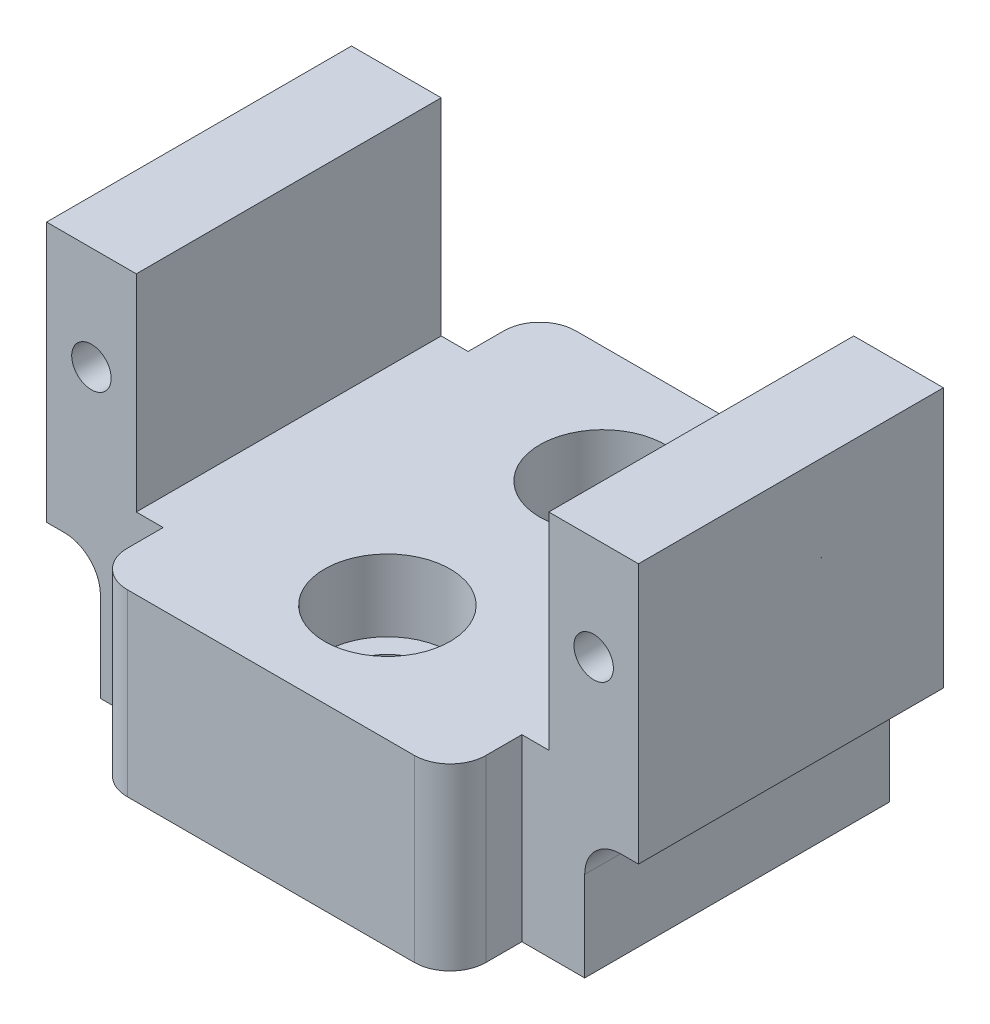
ISO-10303-21;
HEADER;
FILE_DESCRIPTION(('STEP AP214'),'2;1');
FILE_NAME('part.step','',(''),(''),'','','');
FILE_SCHEMA(('AUTOMOTIVE_DESIGN { 1 0 10303 214 1 1 1 1 }'));
ENDSEC;
DATA;
#1=APPLICATION_CONTEXT('core data for automotive mechanical design processes');
#2=APPLICATION_PROTOCOL_DEFINITION('international standard','automotive_design',2000,#1);
#3=PRODUCT_CONTEXT('',#1,'mechanical');
#4=PRODUCT('Part','Part','',(#3));
#5=PRODUCT_RELATED_PRODUCT_CATEGORY('part','',(#4));
#6=PRODUCT_DEFINITION_FORMATION('','',#4);
#7=PRODUCT_DEFINITION_CONTEXT('part definition',#1,'design');
#8=PRODUCT_DEFINITION('design','',#6,#7);
#9=PRODUCT_DEFINITION_SHAPE('','',#8);
#10=(LENGTH_UNIT() NAMED_UNIT(*) SI_UNIT(.MILLI.,.METRE.));
#11=(NAMED_UNIT(*) PLANE_ANGLE_UNIT() SI_UNIT($,.RADIAN.));
#12=(NAMED_UNIT(*) SI_UNIT($,.STERADIAN.) SOLID_ANGLE_UNIT());
#13=UNCERTAINTY_MEASURE_WITH_UNIT(LENGTH_MEASURE(1.E-05),#10,'distance_accuracy_value','');
#14=(GEOMETRIC_REPRESENTATION_CONTEXT(3) GLOBAL_UNCERTAINTY_ASSIGNED_CONTEXT((#13)) GLOBAL_UNIT_ASSIGNED_CONTEXT((#10,
#11,#12)) REPRESENTATION_CONTEXT('',''));
#15=CARTESIAN_POINT('',(0.,0.,0.));
#16=DIRECTION('',(0.,0.,1.));
#17=DIRECTION('',(1.,0.,0.));
#18=AXIS2_PLACEMENT_3D('',#15,#16,#17);
#19=CARTESIAN_POINT('',(16.5,0.,2.50000000000001));
#20=DIRECTION('',(0.,-1.,0.));
#21=DIRECTION('',(0.,0.,-1.));
#22=AXIS2_PLACEMENT_3D('',#19,#20,#21);
#23=CYLINDRICAL_SURFACE('',#22,2.3);
#24=CARTESIAN_POINT('',(16.5,-10.,2.50000000000001));
#25=DIRECTION('',(0.,-1.,0.));
#26=DIRECTION('',(0.,0.,-1.));
#27=AXIS2_PLACEMENT_3D('',#24,#25,#26);
#28=CIRCLE('',#27,2.3);
#29=CARTESIAN_POINT('',(16.5,-10.,0.200000000000008));
#30=VERTEX_POINT('',#29);
#31=EDGE_CURVE('E354',#30,#30,#28,.T.);
#32=ORIENTED_EDGE('',*,*,#31,.T.);
#33=EDGE_LOOP('',(#32));
#34=FACE_BOUND('',#33,.T.);
#35=CARTESIAN_POINT('',(16.5,-4.,2.50000000000001));
#36=DIRECTION('',(0.,1.,0.));
#37=DIRECTION('',(0.,0.,1.));
#38=AXIS2_PLACEMENT_3D('',#35,#36,#37);
#39=CIRCLE('',#38,2.3);
#40=CARTESIAN_POINT('',(16.5,-4.,4.80000000000001));
#41=VERTEX_POINT('',#40);
#42=EDGE_CURVE('E350',#41,#41,#39,.F.);
#43=ORIENTED_EDGE('',*,*,#42,.F.);
#44=EDGE_LOOP('',(#43));
#45=FACE_BOUND('',#44,.T.);
#46=ADVANCED_FACE('F39',(#34,#45),#23,.F.);
#47=CARTESIAN_POINT('',(16.5,0.,14.5));
#48=DIRECTION('',(0.,-1.,0.));
#49=DIRECTION('',(0.,0.,-1.));
#50=AXIS2_PLACEMENT_3D('',#47,#48,#49);
#51=CYLINDRICAL_SURFACE('',#50,2.3);
#52=CARTESIAN_POINT('',(16.5,-10.,14.5));
#53=DIRECTION('',(0.,-1.,0.));
#54=DIRECTION('',(0.,0.,-1.));
#55=AXIS2_PLACEMENT_3D('',#52,#53,#54);
#56=CIRCLE('',#55,2.3);
#57=CARTESIAN_POINT('',(16.5,-10.,12.2));
#58=VERTEX_POINT('',#57);
#59=EDGE_CURVE('E408',#58,#58,#56,.T.);
#60=ORIENTED_EDGE('',*,*,#59,.T.);
#61=EDGE_LOOP('',(#60));
#62=FACE_BOUND('',#61,.T.);
#63=CARTESIAN_POINT('',(16.5,-4.,14.5));
#64=DIRECTION('',(0.,1.,0.));
#65=DIRECTION('',(0.,0.,1.));
#66=AXIS2_PLACEMENT_3D('',#63,#64,#65);
#67=CIRCLE('',#66,2.3);
#68=CARTESIAN_POINT('',(16.5,-4.,16.8));
#69=VERTEX_POINT('',#68);
#70=EDGE_CURVE('E347',#69,#69,#67,.F.);
#71=ORIENTED_EDGE('',*,*,#70,.F.);
#72=EDGE_LOOP('',(#71));
#73=FACE_BOUND('',#72,.T.);
#74=ADVANCED_FACE('F472',(#62,#73),#51,.F.);
#75=CARTESIAN_POINT('',(0.,0.,17.));
#76=DIRECTION('',(0.,0.,1.));
#77=DIRECTION('',(1.,0.,0.));
#78=AXIS2_PLACEMENT_3D('',#75,#76,#77);
#79=PLANE('',#78);
#80=CARTESIAN_POINT('',(30.5,5.75,17.));
#81=DIRECTION('',(0.,0.,1.));
#82=DIRECTION('',(-1.,0.,0.));
#83=AXIS2_PLACEMENT_3D('',#80,#81,#82);
#84=CIRCLE('',#83,1.1);
#85=CARTESIAN_POINT('',(29.4,5.75,17.));
#86=VERTEX_POINT('',#85);
#87=EDGE_CURVE('E391',#86,#86,#84,.T.);
#88=ORIENTED_EDGE('',*,*,#87,.F.);
#89=EDGE_LOOP('',(#88));
#90=FACE_BOUND('',#89,.T.);
#91=DIRECTION('',(-1.,0.,0.));
#92=VECTOR('',#91,1.);
#93=CARTESIAN_POINT('',(5.,0.,17.));
#94=LINE('',#93,#92);
#95=CARTESIAN_POINT('',(28.,0.,17.));
#96=VERTEX_POINT('',#95);
#97=CARTESIAN_POINT('',(26.5,0.,17.));
#98=VERTEX_POINT('',#97);
#99=EDGE_CURVE('E233',#96,#98,#94,.T.);
#100=ORIENTED_EDGE('',*,*,#99,.T.);
#101=DIRECTION('',(0.,-1.,0.));
#102=VECTOR('',#101,1.);
#103=CARTESIAN_POINT('',(26.5,0.,17.));
#104=LINE('',#103,#102);
#105=CARTESIAN_POINT('',(26.5,-10.,17.));
#106=VERTEX_POINT('',#105);
#107=EDGE_CURVE('E219',#98,#106,#104,.T.);
#108=ORIENTED_EDGE('',*,*,#107,.T.);
#109=DIRECTION('',(-1.,0.,0.));
#110=VECTOR('',#109,1.);
#111=CARTESIAN_POINT('',(3.00000000000001,-10.,17.));
#112=LINE('',#111,#110);
#113=CARTESIAN_POINT('',(30.,-10.,17.));
#114=VERTEX_POINT('',#113);
#115=EDGE_CURVE('E230',#114,#106,#112,.T.);
#116=ORIENTED_EDGE('',*,*,#115,.F.);
#117=DIRECTION('',(0.,1.,0.));
#118=VECTOR('',#117,1.);
#119=CARTESIAN_POINT('',(30.,-10.,17.));
#120=LINE('',#119,#118);
#121=CARTESIAN_POINT('',(30.,-5.,17.));
#122=VERTEX_POINT('',#121);
#123=EDGE_CURVE('E262',#114,#122,#120,.T.);
#124=ORIENTED_EDGE('',*,*,#123,.T.);
#125=CARTESIAN_POINT('',(32.,-5.,17.));
#126=DIRECTION('',(0.,0.,1.));
#127=DIRECTION('',(1.,0.,0.));
#128=AXIS2_PLACEMENT_3D('',#125,#126,#127);
#129=CIRCLE('',#128,2.);
#130=CARTESIAN_POINT('',(32.,-3.,17.));
#131=VERTEX_POINT('',#130);
#132=EDGE_CURVE('E342',#122,#131,#129,.F.);
#133=ORIENTED_EDGE('',*,*,#132,.T.);
#134=DIRECTION('',(1.,0.,0.));
#135=VECTOR('',#134,1.);
#136=CARTESIAN_POINT('',(0.,-3.,17.));
#137=LINE('',#136,#135);
#138=CARTESIAN_POINT('',(33.,-3.,17.));
#139=VERTEX_POINT('',#138);
#140=EDGE_CURVE('E268',#131,#139,#137,.T.);
#141=ORIENTED_EDGE('',*,*,#140,.T.);
#142=DIRECTION('',(0.,1.,0.));
#143=VECTOR('',#142,1.);
#144=CARTESIAN_POINT('',(33.,0.,17.));
#145=LINE('',#144,#143);
#146=CARTESIAN_POINT('',(33.,11.5,17.));
#147=VERTEX_POINT('',#146);
#148=EDGE_CURVE('E273',#139,#147,#145,.T.);
#149=ORIENTED_EDGE('',*,*,#148,.T.);
#150=DIRECTION('',(-1.,0.,0.));
#151=VECTOR('',#150,1.);
#152=CARTESIAN_POINT('',(28.,11.5,17.));
#153=LINE('',#152,#151);
#154=CARTESIAN_POINT('',(28.,11.5,17.));
#155=VERTEX_POINT('',#154);
#156=EDGE_CURVE('E275',#147,#155,#153,.T.);
#157=ORIENTED_EDGE('',*,*,#156,.T.);
#158=DIRECTION('',(0.,-1.,0.));
#159=VECTOR('',#158,1.);
#160=CARTESIAN_POINT('',(28.,0.,17.));
#161=LINE('',#160,#159);
#162=EDGE_CURVE('E277',#155,#96,#161,.T.);
#163=ORIENTED_EDGE('',*,*,#162,.T.);
#164=EDGE_LOOP('',(#100,#108,#116,#124,#133,#141,#149,#157,#163));
#165=FACE_BOUND('',#164,.T.);
#166=ADVANCED_FACE('F228',(#90,#165),#79,.T.);
#167=CARTESIAN_POINT('',(0.,0.,0.));
#168=DIRECTION('',(0.,0.,1.));
#169=DIRECTION('',(1.,0.,0.));
#170=AXIS2_PLACEMENT_3D('',#167,#168,#169);
#171=PLANE('',#170);
#172=CARTESIAN_POINT('',(30.5,5.75,0.));
#173=DIRECTION('',(0.,0.,1.));
#174=DIRECTION('',(1.,0.,0.));
#175=AXIS2_PLACEMENT_3D('',#172,#173,#174);
#176=CIRCLE('',#175,1.1);
#177=CARTESIAN_POINT('',(31.6,5.75,0.));
#178=VERTEX_POINT('',#177);
#179=EDGE_CURVE('E43',#178,#178,#176,.T.);
#180=ORIENTED_EDGE('',*,*,#179,.T.);
#181=EDGE_LOOP('',(#180));
#182=FACE_BOUND('',#181,.T.);
#183=DIRECTION('',(0.,-1.,0.));
#184=VECTOR('',#183,1.);
#185=CARTESIAN_POINT('',(26.5,0.,0.));
#186=LINE('',#185,#184);
#187=CARTESIAN_POINT('',(26.5,0.,0.));
#188=VERTEX_POINT('',#187);
#189=CARTESIAN_POINT('',(26.5,-10.,0.));
#190=VERTEX_POINT('',#189);
#191=EDGE_CURVE('E235',#188,#190,#186,.T.);
#192=ORIENTED_EDGE('',*,*,#191,.F.);
#193=DIRECTION('',(-1.,0.,0.));
#194=VECTOR('',#193,1.);
#195=CARTESIAN_POINT('',(5.,0.,0.));
#196=LINE('',#195,#194);
#197=CARTESIAN_POINT('',(28.,0.,0.));
#198=VERTEX_POINT('',#197);
#199=EDGE_CURVE('E297',#198,#188,#196,.T.);
#200=ORIENTED_EDGE('',*,*,#199,.F.);
#201=DIRECTION('',(0.,-1.,0.));
#202=VECTOR('',#201,1.);
#203=CARTESIAN_POINT('',(28.,0.,0.));
#204=LINE('',#203,#202);
#205=CARTESIAN_POINT('',(28.,11.5,0.));
#206=VERTEX_POINT('',#205);
#207=EDGE_CURVE('E294',#206,#198,#204,.T.);
#208=ORIENTED_EDGE('',*,*,#207,.F.);
#209=DIRECTION('',(-1.,0.,0.));
#210=VECTOR('',#209,1.);
#211=CARTESIAN_POINT('',(28.,11.5,0.));
#212=LINE('',#211,#210);
#213=CARTESIAN_POINT('',(33.,11.5,0.));
#214=VERTEX_POINT('',#213);
#215=EDGE_CURVE('E292',#214,#206,#212,.T.);
#216=ORIENTED_EDGE('',*,*,#215,.F.);
#217=DIRECTION('',(0.,1.,0.));
#218=VECTOR('',#217,1.);
#219=CARTESIAN_POINT('',(33.,0.,0.));
#220=LINE('',#219,#218);
#221=CARTESIAN_POINT('',(33.,-3.,0.));
#222=VERTEX_POINT('',#221);
#223=EDGE_CURVE('E290',#222,#214,#220,.T.);
#224=ORIENTED_EDGE('',*,*,#223,.F.);
#225=DIRECTION('',(1.,0.,0.));
#226=VECTOR('',#225,1.);
#227=CARTESIAN_POINT('',(0.,-3.,0.));
#228=LINE('',#227,#226);
#229=CARTESIAN_POINT('',(32.,-3.,0.));
#230=VERTEX_POINT('',#229);
#231=EDGE_CURVE('E264',#230,#222,#228,.T.);
#232=ORIENTED_EDGE('',*,*,#231,.F.);
#233=CARTESIAN_POINT('',(32.,-5.,0.));
#234=DIRECTION('',(0.,0.,1.));
#235=DIRECTION('',(1.,0.,0.));
#236=AXIS2_PLACEMENT_3D('',#233,#234,#235);
#237=CIRCLE('',#236,2.);
#238=CARTESIAN_POINT('',(30.,-5.,0.));
#239=VERTEX_POINT('',#238);
#240=EDGE_CURVE('E344',#230,#239,#237,.T.);
#241=ORIENTED_EDGE('',*,*,#240,.T.);
#242=DIRECTION('',(0.,1.,0.));
#243=VECTOR('',#242,1.);
#244=CARTESIAN_POINT('',(30.,-10.,0.));
#245=LINE('',#244,#243);
#246=CARTESIAN_POINT('',(30.,-10.,0.));
#247=VERTEX_POINT('',#246);
#248=EDGE_CURVE('E253',#247,#239,#245,.T.);
#249=ORIENTED_EDGE('',*,*,#248,.F.);
#250=DIRECTION('',(1.,0.,0.));
#251=VECTOR('',#250,1.);
#252=CARTESIAN_POINT('',(3.00000000000001,-10.,0.));
#253=LINE('',#252,#251);
#254=EDGE_CURVE('E245',#190,#247,#253,.T.);
#255=ORIENTED_EDGE('',*,*,#254,.F.);
#256=EDGE_LOOP('',(#192,#200,#208,#216,#224,#232,#241,#249,#255));
#257=FACE_BOUND('',#256,.T.);
#258=ADVANCED_FACE('F517',(#182,#257),#171,.F.);
#259=CARTESIAN_POINT('',(0.,-3.,17.));
#260=DIRECTION('',(0.,1.,0.));
#261=DIRECTION('',(0.,0.,1.));
#262=AXIS2_PLACEMENT_3D('',#259,#260,#261);
#263=PLANE('',#262);
#264=ORIENTED_EDGE('',*,*,#140,.F.);
#265=DIRECTION('',(0.,0.,1.));
#266=VECTOR('',#265,1.);
#267=CARTESIAN_POINT('',(32.,-3.,0.));
#268=LINE('',#267,#266);
#269=EDGE_CURVE('E336',#131,#230,#268,.F.);
#270=ORIENTED_EDGE('',*,*,#269,.T.);
#271=ORIENTED_EDGE('',*,*,#231,.T.);
#272=DIRECTION('',(0.,0.,-1.));
#273=VECTOR('',#272,1.);
#274=CARTESIAN_POINT('',(33.,-3.,17.));
#275=LINE('',#274,#273);
#276=EDGE_CURVE('E322',#139,#222,#275,.T.);
#277=ORIENTED_EDGE('',*,*,#276,.F.);
#278=EDGE_LOOP('',(#264,#270,#271,#277));
#279=FACE_BOUND('',#278,.T.);
#280=ADVANCED_FACE('F545',(#279),#263,.F.);
#281=CARTESIAN_POINT('',(0.,-3.,0.));
#282=VERTEX_POINT('',#281);
#283=CARTESIAN_POINT('',(1.00000000000001,-3.,0.));
#284=VERTEX_POINT('',#283);
#285=EDGE_CURVE('E287',#282,#284,#228,.T.);
#286=ORIENTED_EDGE('',*,*,#285,.T.);
#287=DIRECTION('',(0.,0.,-1.));
#288=VECTOR('',#287,1.);
#289=CARTESIAN_POINT('',(1.00000000000001,-3.,17.));
#290=LINE('',#289,#288);
#291=CARTESIAN_POINT('',(1.00000000000001,-3.,17.));
#292=VERTEX_POINT('',#291);
#293=EDGE_CURVE('E331',#284,#292,#290,.F.);
#294=ORIENTED_EDGE('',*,*,#293,.T.);
#295=CARTESIAN_POINT('',(0.,-3.,17.));
#296=VERTEX_POINT('',#295);
#297=EDGE_CURVE('E270',#296,#292,#137,.T.);
#298=ORIENTED_EDGE('',*,*,#297,.F.);
#299=DIRECTION('',(0.,0.,-1.));
#300=VECTOR('',#299,1.);
#301=CARTESIAN_POINT('',(0.,-3.,17.));
#302=LINE('',#301,#300);
#303=EDGE_CURVE('E325',#296,#282,#302,.T.);
#304=ORIENTED_EDGE('',*,*,#303,.T.);
#305=EDGE_LOOP('',(#286,#294,#298,#304));
#306=FACE_BOUND('',#305,.T.);
#307=ADVANCED_FACE('F543',(#306),#263,.F.);
#308=CARTESIAN_POINT('',(33.,0.,17.));
#309=DIRECTION('',(-1.,0.,0.));
#310=DIRECTION('',(0.,0.,1.));
#311=AXIS2_PLACEMENT_3D('',#308,#309,#310);
#312=PLANE('',#311);
#313=ORIENTED_EDGE('',*,*,#223,.T.);
#314=DIRECTION('',(0.,0.,-1.));
#315=VECTOR('',#314,1.);
#316=CARTESIAN_POINT('',(33.,11.5,17.));
#317=LINE('',#316,#315);
#318=EDGE_CURVE('E319',#147,#214,#317,.T.);
#319=ORIENTED_EDGE('',*,*,#318,.F.);
#320=ORIENTED_EDGE('',*,*,#148,.F.);
#321=ORIENTED_EDGE('',*,*,#276,.T.);
#322=EDGE_LOOP('',(#313,#319,#320,#321));
#323=FACE_BOUND('',#322,.T.);
#324=ADVANCED_FACE('F539',(#323),#312,.F.);
#325=CARTESIAN_POINT('',(28.,11.5,17.));
#326=DIRECTION('',(0.,-1.,0.));
#327=DIRECTION('',(0.,0.,-1.));
#328=AXIS2_PLACEMENT_3D('',#325,#326,#327);
#329=PLANE('',#328);
#330=ORIENTED_EDGE('',*,*,#215,.T.);
#331=DIRECTION('',(0.,0.,-1.));
#332=VECTOR('',#331,1.);
#333=CARTESIAN_POINT('',(28.,11.5,17.));
#334=LINE('',#333,#332);
#335=EDGE_CURVE('E316',#155,#206,#334,.T.);
#336=ORIENTED_EDGE('',*,*,#335,.F.);
#337=ORIENTED_EDGE('',*,*,#156,.F.);
#338=ORIENTED_EDGE('',*,*,#318,.T.);
#339=EDGE_LOOP('',(#330,#336,#337,#338));
#340=FACE_BOUND('',#339,.T.);
#341=ADVANCED_FACE('F535',(#340),#329,.F.);
#342=CARTESIAN_POINT('',(28.,0.,17.));
#343=DIRECTION('',(1.,0.,0.));
#344=DIRECTION('',(0.,0.,-1.));
#345=AXIS2_PLACEMENT_3D('',#342,#343,#344);
#346=PLANE('',#345);
#347=ORIENTED_EDGE('',*,*,#207,.T.);
#348=DIRECTION('',(0.,0.,-1.));
#349=VECTOR('',#348,1.);
#350=CARTESIAN_POINT('',(28.,0.,17.));
#351=LINE('',#350,#349);
#352=EDGE_CURVE('E313',#96,#198,#351,.T.);
#353=ORIENTED_EDGE('',*,*,#352,.F.);
#354=ORIENTED_EDGE('',*,*,#162,.F.);
#355=ORIENTED_EDGE('',*,*,#335,.T.);
#356=EDGE_LOOP('',(#347,#353,#354,#355));
#357=FACE_BOUND('',#356,.T.);
#358=ADVANCED_FACE('F531',(#357),#346,.F.);
#359=CARTESIAN_POINT('',(5.,0.,17.));
#360=DIRECTION('',(0.,-1.,0.));
#361=DIRECTION('',(0.,0.,-1.));
#362=AXIS2_PLACEMENT_3D('',#359,#360,#361);
#363=PLANE('',#362);
#364=CARTESIAN_POINT('',(16.5,0.,2.50000000000001));
#365=DIRECTION('',(0.,1.,0.));
#366=DIRECTION('',(0.,0.,1.));
#367=AXIS2_PLACEMENT_3D('',#364,#365,#366);
#368=CIRCLE('',#367,3.5);
#369=CARTESIAN_POINT('',(16.5,0.,6.00000000000001));
#370=VERTEX_POINT('',#369);
#371=EDGE_CURVE('E400',#370,#370,#368,.T.);
#372=ORIENTED_EDGE('',*,*,#371,.F.);
#373=EDGE_LOOP('',(#372));
#374=FACE_BOUND('',#373,.T.);
#375=CARTESIAN_POINT('',(16.5,0.,14.5));
#376=DIRECTION('',(0.,1.,0.));
#377=DIRECTION('',(0.,0.,1.));
#378=AXIS2_PLACEMENT_3D('',#375,#376,#377);
#379=CIRCLE('',#378,3.5);
#380=CARTESIAN_POINT('',(16.5,0.,18.));
#381=VERTEX_POINT('',#380);
#382=EDGE_CURVE('E403',#381,#381,#379,.T.);
#383=ORIENTED_EDGE('',*,*,#382,.F.);
#384=EDGE_LOOP('',(#383));
#385=FACE_BOUND('',#384,.T.);
#386=DIRECTION('',(0.,0.,-1.));
#387=VECTOR('',#386,1.);
#388=CARTESIAN_POINT('',(26.5,0.,21.));
#389=LINE('',#388,#387);
#390=CARTESIAN_POINT('',(26.5,0.,-1.99999999999999));
#391=VERTEX_POINT('',#390);
#392=EDGE_CURVE('E420',#188,#391,#389,.T.);
#393=ORIENTED_EDGE('',*,*,#392,.T.);
#394=CARTESIAN_POINT('',(24.5,0.,-1.99999999999999));
#395=DIRECTION('',(0.,-1.,0.));
#396=DIRECTION('',(0.,0.,-1.));
#397=AXIS2_PLACEMENT_3D('',#394,#395,#396);
#398=CIRCLE('',#397,2.);
#399=CARTESIAN_POINT('',(24.5,0.,-3.99999999999999));
#400=VERTEX_POINT('',#399);
#401=EDGE_CURVE('E373',#391,#400,#398,.F.);
#402=ORIENTED_EDGE('',*,*,#401,.T.);
#403=DIRECTION('',(1.,0.,0.));
#404=VECTOR('',#403,1.);
#405=CARTESIAN_POINT('',(6.50000000000001,0.,-3.99999999999999));
#406=LINE('',#405,#404);
#407=CARTESIAN_POINT('',(8.50000000000001,0.,-3.99999999999999));
#408=VERTEX_POINT('',#407);
#409=EDGE_CURVE('E416',#408,#400,#406,.T.);
#410=ORIENTED_EDGE('',*,*,#409,.F.);
#411=CARTESIAN_POINT('',(8.50000000000001,0.,-1.99999999999999));
#412=DIRECTION('',(0.,-1.,0.));
#413=DIRECTION('',(0.,0.,-1.));
#414=AXIS2_PLACEMENT_3D('',#411,#412,#413);
#415=CIRCLE('',#414,2.);
#416=CARTESIAN_POINT('',(6.50000000000001,0.,-1.99999999999999));
#417=VERTEX_POINT('',#416);
#418=EDGE_CURVE('E56',#408,#417,#415,.F.);
#419=ORIENTED_EDGE('',*,*,#418,.T.);
#420=DIRECTION('',(0.,0.,-1.));
#421=VECTOR('',#420,1.);
#422=CARTESIAN_POINT('',(6.50000000000001,0.,21.));
#423=LINE('',#422,#421);
#424=CARTESIAN_POINT('',(6.50000000000001,0.,0.));
#425=VERTEX_POINT('',#424);
#426=EDGE_CURVE('E417',#425,#417,#423,.T.);
#427=ORIENTED_EDGE('',*,*,#426,.F.);
#428=CARTESIAN_POINT('',(5.,0.,0.));
#429=VERTEX_POINT('',#428);
#430=EDGE_CURVE('E296',#425,#429,#196,.T.);
#431=ORIENTED_EDGE('',*,*,#430,.T.);
#432=DIRECTION('',(0.,0.,-1.));
#433=VECTOR('',#432,1.);
#434=CARTESIAN_POINT('',(5.,0.,17.));
#435=LINE('',#434,#433);
#436=CARTESIAN_POINT('',(5.,0.,17.));
#437=VERTEX_POINT('',#436);
#438=EDGE_CURVE('E310',#437,#429,#435,.T.);
#439=ORIENTED_EDGE('',*,*,#438,.F.);
#440=CARTESIAN_POINT('',(6.50000000000001,0.,17.));
#441=VERTEX_POINT('',#440);
#442=EDGE_CURVE('E279',#441,#437,#94,.T.);
#443=ORIENTED_EDGE('',*,*,#442,.F.);
#444=CARTESIAN_POINT('',(6.50000000000001,0.,19.));
#445=VERTEX_POINT('',#444);
#446=EDGE_CURVE('E414',#445,#441,#423,.T.);
#447=ORIENTED_EDGE('',*,*,#446,.F.);
#448=CARTESIAN_POINT('',(8.50000000000001,0.,19.));
#449=DIRECTION('',(0.,-1.,0.));
#450=DIRECTION('',(0.,0.,-1.));
#451=AXIS2_PLACEMENT_3D('',#448,#449,#450);
#452=CIRCLE('',#451,2.);
#453=CARTESIAN_POINT('',(8.50000000000001,0.,21.));
#454=VERTEX_POINT('',#453);
#455=EDGE_CURVE('E370',#445,#454,#452,.F.);
#456=ORIENTED_EDGE('',*,*,#455,.T.);
#457=DIRECTION('',(1.,0.,0.));
#458=VECTOR('',#457,1.);
#459=CARTESIAN_POINT('',(6.50000000000001,0.,21.));
#460=LINE('',#459,#458);
#461=CARTESIAN_POINT('',(24.5,0.,21.));
#462=VERTEX_POINT('',#461);
#463=EDGE_CURVE('E423',#454,#462,#460,.T.);
#464=ORIENTED_EDGE('',*,*,#463,.T.);
#465=CARTESIAN_POINT('',(24.5,0.,19.));
#466=DIRECTION('',(0.,-1.,0.));
#467=DIRECTION('',(0.,0.,-1.));
#468=AXIS2_PLACEMENT_3D('',#465,#466,#467);
#469=CIRCLE('',#468,2.);
#470=CARTESIAN_POINT('',(26.5,0.,19.));
#471=VERTEX_POINT('',#470);
#472=EDGE_CURVE('E63',#462,#471,#469,.F.);
#473=ORIENTED_EDGE('',*,*,#472,.T.);
#474=EDGE_CURVE('E421',#471,#98,#389,.T.);
#475=ORIENTED_EDGE('',*,*,#474,.T.);
#476=ORIENTED_EDGE('',*,*,#99,.F.);
#477=ORIENTED_EDGE('',*,*,#352,.T.);
#478=ORIENTED_EDGE('',*,*,#199,.T.);
#479=EDGE_LOOP('',(#393,#402,#410,#419,#427,#431,#439,#443,#447,#456,#464,#473,#475,#476,#477,#478));
#480=FACE_BOUND('',#479,.T.);
#481=ADVANCED_FACE('F459',(#374,#385,#480),#363,.F.);
#482=CARTESIAN_POINT('',(5.,0.,17.));
#483=DIRECTION('',(-1.,0.,0.));
#484=DIRECTION('',(0.,0.,1.));
#485=AXIS2_PLACEMENT_3D('',#482,#483,#484);
#486=PLANE('',#485);
#487=DIRECTION('',(0.,1.,0.));
#488=VECTOR('',#487,1.);
#489=CARTESIAN_POINT('',(5.,0.,0.));
#490=LINE('',#489,#488);
#491=CARTESIAN_POINT('',(5.,11.5,0.));
#492=VERTEX_POINT('',#491);
#493=EDGE_CURVE('E300',#429,#492,#490,.T.);
#494=ORIENTED_EDGE('',*,*,#493,.T.);
#495=DIRECTION('',(0.,0.,-1.));
#496=VECTOR('',#495,1.);
#497=CARTESIAN_POINT('',(5.,11.5,17.));
#498=LINE('',#497,#496);
#499=CARTESIAN_POINT('',(5.,11.5,17.));
#500=VERTEX_POINT('',#499);
#501=EDGE_CURVE('E307',#500,#492,#498,.T.);
#502=ORIENTED_EDGE('',*,*,#501,.F.);
#503=DIRECTION('',(0.,1.,0.));
#504=VECTOR('',#503,1.);
#505=CARTESIAN_POINT('',(5.,0.,17.));
#506=LINE('',#505,#504);
#507=EDGE_CURVE('E281',#437,#500,#506,.T.);
#508=ORIENTED_EDGE('',*,*,#507,.F.);
#509=ORIENTED_EDGE('',*,*,#438,.T.);
#510=EDGE_LOOP('',(#494,#502,#508,#509));
#511=FACE_BOUND('',#510,.T.);
#512=ADVANCED_FACE('F524',(#511),#486,.F.);
#513=CARTESIAN_POINT('',(0.,11.5,17.));
#514=DIRECTION('',(0.,-1.,0.));
#515=DIRECTION('',(0.,0.,-1.));
#516=AXIS2_PLACEMENT_3D('',#513,#514,#515);
#517=PLANE('',#516);
#518=DIRECTION('',(-1.,0.,0.));
#519=VECTOR('',#518,1.);
#520=CARTESIAN_POINT('',(0.,11.5,0.));
#521=LINE('',#520,#519);
#522=CARTESIAN_POINT('',(0.,11.5,0.));
#523=VERTEX_POINT('',#522);
#524=EDGE_CURVE('E302',#492,#523,#521,.T.);
#525=ORIENTED_EDGE('',*,*,#524,.T.);
#526=DIRECTION('',(0.,0.,-1.));
#527=VECTOR('',#526,1.);
#528=CARTESIAN_POINT('',(0.,11.5,17.));
#529=LINE('',#528,#527);
#530=CARTESIAN_POINT('',(0.,11.5,17.));
#531=VERTEX_POINT('',#530);
#532=EDGE_CURVE('E286',#531,#523,#529,.T.);
#533=ORIENTED_EDGE('',*,*,#532,.F.);
#534=DIRECTION('',(-1.,0.,0.));
#535=VECTOR('',#534,1.);
#536=CARTESIAN_POINT('',(0.,11.5,17.));
#537=LINE('',#536,#535);
#538=EDGE_CURVE('E283',#500,#531,#537,.T.);
#539=ORIENTED_EDGE('',*,*,#538,.F.);
#540=ORIENTED_EDGE('',*,*,#501,.T.);
#541=EDGE_LOOP('',(#525,#533,#539,#540));
#542=FACE_BOUND('',#541,.T.);
#543=ADVANCED_FACE('F520',(#542),#517,.F.);
#544=CARTESIAN_POINT('',(0.,0.,17.));
#545=DIRECTION('',(1.,0.,0.));
#546=DIRECTION('',(0.,0.,-1.));
#547=AXIS2_PLACEMENT_3D('',#544,#545,#546);
#548=PLANE('',#547);
#549=DIRECTION('',(0.,-1.,0.));
#550=VECTOR('',#549,1.);
#551=CARTESIAN_POINT('',(0.,0.,0.));
#552=LINE('',#551,#550);
#553=EDGE_CURVE('E269',#523,#282,#552,.T.);
#554=ORIENTED_EDGE('',*,*,#553,.T.);
#555=ORIENTED_EDGE('',*,*,#303,.F.);
#556=DIRECTION('',(0.,-1.,0.));
#557=VECTOR('',#556,1.);
#558=CARTESIAN_POINT('',(0.,0.,17.));
#559=LINE('',#558,#557);
#560=EDGE_CURVE('E265',#531,#296,#559,.T.);
#561=ORIENTED_EDGE('',*,*,#560,.F.);
#562=ORIENTED_EDGE('',*,*,#532,.T.);
#563=EDGE_LOOP('',(#554,#555,#561,#562));
#564=FACE_BOUND('',#563,.T.);
#565=ADVANCED_FACE('F513',(#564),#548,.F.);
#566=CARTESIAN_POINT('',(2.5,5.75,17.));
#567=DIRECTION('',(0.,0.,1.));
#568=DIRECTION('',(1.,0.,0.));
#569=AXIS2_PLACEMENT_3D('',#566,#567,#568);
#570=CIRCLE('',#569,1.1);
#571=CARTESIAN_POINT('',(3.6,5.75,17.));
#572=VERTEX_POINT('',#571);
#573=EDGE_CURVE('E385',#572,#572,#570,.T.);
#574=ORIENTED_EDGE('',*,*,#573,.F.);
#575=EDGE_LOOP('',(#574));
#576=FACE_BOUND('',#575,.T.);
#577=DIRECTION('',(0.,-1.,0.));
#578=VECTOR('',#577,1.);
#579=CARTESIAN_POINT('',(6.50000000000001,0.,17.));
#580=LINE('',#579,#578);
#581=CARTESIAN_POINT('',(6.50000000000001,-10.,17.));
#582=VERTEX_POINT('',#581);
#583=EDGE_CURVE('E434',#441,#582,#580,.T.);
#584=ORIENTED_EDGE('',*,*,#583,.F.);
#585=ORIENTED_EDGE('',*,*,#442,.T.);
#586=ORIENTED_EDGE('',*,*,#507,.T.);
#587=ORIENTED_EDGE('',*,*,#538,.T.);
#588=ORIENTED_EDGE('',*,*,#560,.T.);
#589=ORIENTED_EDGE('',*,*,#297,.T.);
#590=CARTESIAN_POINT('',(1.00000000000001,-5.,17.));
#591=DIRECTION('',(0.,0.,1.));
#592=DIRECTION('',(1.,0.,0.));
#593=AXIS2_PLACEMENT_3D('',#590,#591,#592);
#594=CIRCLE('',#593,2.);
#595=CARTESIAN_POINT('',(3.00000000000001,-5.,17.));
#596=VERTEX_POINT('',#595);
#597=EDGE_CURVE('E340',#292,#596,#594,.F.);
#598=ORIENTED_EDGE('',*,*,#597,.T.);
#599=DIRECTION('',(0.,1.,0.));
#600=VECTOR('',#599,1.);
#601=CARTESIAN_POINT('',(3.00000000000001,-10.,17.));
#602=LINE('',#601,#600);
#603=CARTESIAN_POINT('',(3.00000000000001,-10.,17.));
#604=VERTEX_POINT('',#603);
#605=EDGE_CURVE('E259',#604,#596,#602,.T.);
#606=ORIENTED_EDGE('',*,*,#605,.F.);
#607=EDGE_CURVE('E243',#582,#604,#112,.T.);
#608=ORIENTED_EDGE('',*,*,#607,.F.);
#609=EDGE_LOOP('',(#584,#585,#586,#587,#588,#589,#598,#606,#608));
#610=FACE_BOUND('',#609,.T.);
#611=ADVANCED_FACE('F446',(#576,#610),#79,.T.);
#612=CARTESIAN_POINT('',(2.5,5.75,0.));
#613=DIRECTION('',(0.,0.,1.));
#614=DIRECTION('',(1.,0.,0.));
#615=AXIS2_PLACEMENT_3D('',#612,#613,#614);
#616=CIRCLE('',#615,1.1);
#617=CARTESIAN_POINT('',(3.6,5.75,0.));
#618=VERTEX_POINT('',#617);
#619=EDGE_CURVE('E383',#618,#618,#616,.T.);
#620=ORIENTED_EDGE('',*,*,#619,.T.);
#621=EDGE_LOOP('',(#620));
#622=FACE_BOUND('',#621,.T.);
#623=ORIENTED_EDGE('',*,*,#430,.F.);
#624=DIRECTION('',(0.,-1.,0.));
#625=VECTOR('',#624,1.);
#626=CARTESIAN_POINT('',(6.50000000000001,0.,0.));
#627=LINE('',#626,#625);
#628=CARTESIAN_POINT('',(6.50000000000001,-10.,0.));
#629=VERTEX_POINT('',#628);
#630=EDGE_CURVE('E234',#425,#629,#627,.T.);
#631=ORIENTED_EDGE('',*,*,#630,.T.);
#632=CARTESIAN_POINT('',(3.00000000000001,-10.,0.));
#633=VERTEX_POINT('',#632);
#634=EDGE_CURVE('E250',#633,#629,#253,.T.);
#635=ORIENTED_EDGE('',*,*,#634,.F.);
#636=DIRECTION('',(0.,1.,0.));
#637=VECTOR('',#636,1.);
#638=CARTESIAN_POINT('',(3.00000000000001,-10.,0.));
#639=LINE('',#638,#637);
#640=CARTESIAN_POINT('',(3.00000000000001,-5.,0.));
#641=VERTEX_POINT('',#640);
#642=EDGE_CURVE('E256',#633,#641,#639,.T.);
#643=ORIENTED_EDGE('',*,*,#642,.T.);
#644=CARTESIAN_POINT('',(1.00000000000001,-5.,0.));
#645=DIRECTION('',(0.,0.,1.));
#646=DIRECTION('',(1.,0.,0.));
#647=AXIS2_PLACEMENT_3D('',#644,#645,#646);
#648=CIRCLE('',#647,2.);
#649=EDGE_CURVE('E338',#641,#284,#648,.T.);
#650=ORIENTED_EDGE('',*,*,#649,.T.);
#651=ORIENTED_EDGE('',*,*,#285,.F.);
#652=ORIENTED_EDGE('',*,*,#553,.F.);
#653=ORIENTED_EDGE('',*,*,#524,.F.);
#654=ORIENTED_EDGE('',*,*,#493,.F.);
#655=EDGE_LOOP('',(#623,#631,#635,#643,#650,#651,#652,#653,#654));
#656=FACE_BOUND('',#655,.T.);
#657=ADVANCED_FACE('F501',(#622,#656),#171,.F.);
#658=CARTESIAN_POINT('',(0.,-10.,0.));
#659=DIRECTION('',(0.,1.,0.));
#660=DIRECTION('',(0.,0.,1.));
#661=AXIS2_PLACEMENT_3D('',#658,#659,#660);
#662=PLANE('',#661);
#663=ORIENTED_EDGE('',*,*,#59,.F.);
#664=EDGE_LOOP('',(#663));
#665=FACE_BOUND('',#664,.T.);
#666=ORIENTED_EDGE('',*,*,#31,.F.);
#667=EDGE_LOOP('',(#666));
#668=FACE_BOUND('',#667,.T.);
#669=DIRECTION('',(1.,0.,0.));
#670=VECTOR('',#669,1.);
#671=CARTESIAN_POINT('',(6.50000000000001,-10.,-3.99999999999999));
#672=LINE('',#671,#670);
#673=CARTESIAN_POINT('',(8.50000000000001,-10.,-3.99999999999999));
#674=VERTEX_POINT('',#673);
#675=CARTESIAN_POINT('',(24.5,-10.,-3.99999999999999));
#676=VERTEX_POINT('',#675);
#677=EDGE_CURVE('E427',#674,#676,#672,.T.);
#678=ORIENTED_EDGE('',*,*,#677,.T.);
#679=CARTESIAN_POINT('',(24.5,-10.,-1.99999999999999));
#680=DIRECTION('',(0.,1.,0.));
#681=DIRECTION('',(0.,0.,1.));
#682=AXIS2_PLACEMENT_3D('',#679,#680,#681);
#683=CIRCLE('',#682,2.);
#684=CARTESIAN_POINT('',(26.5,-10.,-1.99999999999999));
#685=VERTEX_POINT('',#684);
#686=EDGE_CURVE('E365',#676,#685,#683,.F.);
#687=ORIENTED_EDGE('',*,*,#686,.T.);
#688=DIRECTION('',(0.,0.,-1.));
#689=VECTOR('',#688,1.);
#690=CARTESIAN_POINT('',(26.5,-10.,21.));
#691=LINE('',#690,#689);
#692=EDGE_CURVE('E225',#190,#685,#691,.T.);
#693=ORIENTED_EDGE('',*,*,#692,.F.);
#694=ORIENTED_EDGE('',*,*,#254,.T.);
#695=DIRECTION('',(0.,0.,1.));
#696=VECTOR('',#695,1.);
#697=CARTESIAN_POINT('',(30.,-10.,0.));
#698=LINE('',#697,#696);
#699=EDGE_CURVE('E240',#247,#114,#698,.T.);
#700=ORIENTED_EDGE('',*,*,#699,.T.);
#701=ORIENTED_EDGE('',*,*,#115,.T.);
#702=CARTESIAN_POINT('',(26.5,-10.,19.));
#703=VERTEX_POINT('',#702);
#704=EDGE_CURVE('E216',#703,#106,#691,.T.);
#705=ORIENTED_EDGE('',*,*,#704,.F.);
#706=CARTESIAN_POINT('',(24.5,-10.,19.));
#707=DIRECTION('',(0.,1.,0.));
#708=DIRECTION('',(0.,0.,1.));
#709=AXIS2_PLACEMENT_3D('',#706,#707,#708);
#710=CIRCLE('',#709,2.);
#711=CARTESIAN_POINT('',(24.5,-10.,21.));
#712=VERTEX_POINT('',#711);
#713=EDGE_CURVE('E359',#703,#712,#710,.F.);
#714=ORIENTED_EDGE('',*,*,#713,.T.);
#715=DIRECTION('',(1.,0.,0.));
#716=VECTOR('',#715,1.);
#717=CARTESIAN_POINT('',(6.50000000000001,-10.,21.));
#718=LINE('',#717,#716);
#719=CARTESIAN_POINT('',(8.50000000000001,-10.,21.));
#720=VERTEX_POINT('',#719);
#721=EDGE_CURVE('E224',#720,#712,#718,.T.);
#722=ORIENTED_EDGE('',*,*,#721,.F.);
#723=CARTESIAN_POINT('',(8.50000000000001,-10.,19.));
#724=DIRECTION('',(0.,1.,0.));
#725=DIRECTION('',(0.,0.,1.));
#726=AXIS2_PLACEMENT_3D('',#723,#724,#725);
#727=CIRCLE('',#726,2.);
#728=CARTESIAN_POINT('',(6.50000000000001,-10.,19.));
#729=VERTEX_POINT('',#728);
#730=EDGE_CURVE('E361',#720,#729,#727,.F.);
#731=ORIENTED_EDGE('',*,*,#730,.T.);
#732=DIRECTION('',(0.,0.,-1.));
#733=VECTOR('',#732,1.);
#734=CARTESIAN_POINT('',(6.50000000000001,-10.,21.));
#735=LINE('',#734,#733);
#736=EDGE_CURVE('E425',#729,#582,#735,.T.);
#737=ORIENTED_EDGE('',*,*,#736,.T.);
#738=ORIENTED_EDGE('',*,*,#607,.T.);
#739=DIRECTION('',(0.,0.,-1.));
#740=VECTOR('',#739,1.);
#741=CARTESIAN_POINT('',(3.00000000000001,-10.,0.));
#742=LINE('',#741,#740);
#743=EDGE_CURVE('E242',#604,#633,#742,.T.);
#744=ORIENTED_EDGE('',*,*,#743,.T.);
#745=ORIENTED_EDGE('',*,*,#634,.T.);
#746=CARTESIAN_POINT('',(6.50000000000001,-10.,-1.99999999999999));
#747=VERTEX_POINT('',#746);
#748=EDGE_CURVE('E411',#629,#747,#735,.T.);
#749=ORIENTED_EDGE('',*,*,#748,.T.);
#750=CARTESIAN_POINT('',(8.50000000000001,-10.,-1.99999999999999));
#751=DIRECTION('',(0.,1.,0.));
#752=DIRECTION('',(0.,0.,1.));
#753=AXIS2_PLACEMENT_3D('',#750,#751,#752);
#754=CIRCLE('',#753,2.);
#755=EDGE_CURVE('E363',#747,#674,#754,.F.);
#756=ORIENTED_EDGE('',*,*,#755,.T.);
#757=EDGE_LOOP('',(#678,#687,#693,#694,#700,#701,#705,#714,#722,#731,#737,#738,#744,#745,#749,#756));
#758=FACE_BOUND('',#757,.T.);
#759=ADVANCED_FACE('F238',(#665,#668,#758),#662,.F.);
#760=CARTESIAN_POINT('',(30.,-10.,0.));
#761=DIRECTION('',(-1.,0.,0.));
#762=DIRECTION('',(0.,0.,1.));
#763=AXIS2_PLACEMENT_3D('',#760,#761,#762);
#764=PLANE('',#763);
#765=ORIENTED_EDGE('',*,*,#248,.T.);
#766=DIRECTION('',(0.,0.,1.));
#767=VECTOR('',#766,1.);
#768=CARTESIAN_POINT('',(30.,-5.,17.));
#769=LINE('',#768,#767);
#770=EDGE_CURVE('E333',#239,#122,#769,.T.);
#771=ORIENTED_EDGE('',*,*,#770,.T.);
#772=ORIENTED_EDGE('',*,*,#123,.F.);
#773=ORIENTED_EDGE('',*,*,#699,.F.);
#774=EDGE_LOOP('',(#765,#771,#772,#773));
#775=FACE_BOUND('',#774,.T.);
#776=ADVANCED_FACE('F500',(#775),#764,.F.);
#777=CARTESIAN_POINT('',(3.00000000000001,-10.,0.));
#778=DIRECTION('',(1.,0.,0.));
#779=DIRECTION('',(0.,0.,-1.));
#780=AXIS2_PLACEMENT_3D('',#777,#778,#779);
#781=PLANE('',#780);
#782=ORIENTED_EDGE('',*,*,#605,.T.);
#783=DIRECTION('',(0.,0.,-1.));
#784=VECTOR('',#783,1.);
#785=CARTESIAN_POINT('',(3.00000000000001,-5.,0.));
#786=LINE('',#785,#784);
#787=EDGE_CURVE('E328',#596,#641,#786,.T.);
#788=ORIENTED_EDGE('',*,*,#787,.T.);
#789=ORIENTED_EDGE('',*,*,#642,.F.);
#790=ORIENTED_EDGE('',*,*,#743,.F.);
#791=EDGE_LOOP('',(#782,#788,#789,#790));
#792=FACE_BOUND('',#791,.T.);
#793=ADVANCED_FACE('F503',(#792),#781,.F.);
#794=CARTESIAN_POINT('',(1.00000000000001,-5.,0.));
#795=DIRECTION('',(0.,0.,1.));
#796=DIRECTION('',(1.,0.,0.));
#797=AXIS2_PLACEMENT_3D('',#794,#795,#796);
#798=CYLINDRICAL_SURFACE('',#797,2.);
#799=ORIENTED_EDGE('',*,*,#597,.F.);
#800=ORIENTED_EDGE('',*,*,#293,.F.);
#801=ORIENTED_EDGE('',*,*,#649,.F.);
#802=ORIENTED_EDGE('',*,*,#787,.F.);
#803=EDGE_LOOP('',(#799,#800,#801,#802));
#804=FACE_BOUND('',#803,.T.);
#805=ADVANCED_FACE('F506',(#804),#798,.F.);
#806=CARTESIAN_POINT('',(32.,-5.,0.));
#807=DIRECTION('',(0.,0.,-1.));
#808=DIRECTION('',(-1.,0.,0.));
#809=AXIS2_PLACEMENT_3D('',#806,#807,#808);
#810=CYLINDRICAL_SURFACE('',#809,2.);
#811=ORIENTED_EDGE('',*,*,#240,.F.);
#812=ORIENTED_EDGE('',*,*,#269,.F.);
#813=ORIENTED_EDGE('',*,*,#132,.F.);
#814=ORIENTED_EDGE('',*,*,#770,.F.);
#815=EDGE_LOOP('',(#811,#812,#813,#814));
#816=FACE_BOUND('',#815,.T.);
#817=ADVANCED_FACE('F493',(#816),#810,.F.);
#818=CARTESIAN_POINT('',(6.50000000000001,0.,-3.99999999999999));
#819=DIRECTION('',(0.,0.,-1.));
#820=DIRECTION('',(-1.,0.,0.));
#821=AXIS2_PLACEMENT_3D('',#818,#819,#820);
#822=PLANE('',#821);
#823=ORIENTED_EDGE('',*,*,#409,.T.);
#824=DIRECTION('',(0.,-1.,0.));
#825=VECTOR('',#824,1.);
#826=CARTESIAN_POINT('',(24.5,-10.,-3.99999999999999));
#827=LINE('',#826,#825);
#828=EDGE_CURVE('E356',#400,#676,#827,.T.);
#829=ORIENTED_EDGE('',*,*,#828,.T.);
#830=ORIENTED_EDGE('',*,*,#677,.F.);
#831=DIRECTION('',(0.,-1.,0.));
#832=VECTOR('',#831,1.);
#833=CARTESIAN_POINT('',(8.50000000000001,0.,-3.99999999999999));
#834=LINE('',#833,#832);
#835=EDGE_CURVE('E346',#674,#408,#834,.F.);
#836=ORIENTED_EDGE('',*,*,#835,.T.);
#837=EDGE_LOOP('',(#823,#829,#830,#836));
#838=FACE_BOUND('',#837,.T.);
#839=ADVANCED_FACE('F490',(#838),#822,.T.);
#840=CARTESIAN_POINT('',(26.5,0.,21.));
#841=DIRECTION('',(-1.,0.,0.));
#842=DIRECTION('',(0.,0.,1.));
#843=AXIS2_PLACEMENT_3D('',#840,#841,#842);
#844=PLANE('',#843);
#845=ORIENTED_EDGE('',*,*,#692,.T.);
#846=DIRECTION('',(0.,-1.,0.));
#847=VECTOR('',#846,1.);
#848=CARTESIAN_POINT('',(26.5,0.,-1.99999999999999));
#849=LINE('',#848,#847);
#850=EDGE_CURVE('E367',#685,#391,#849,.F.);
#851=ORIENTED_EDGE('',*,*,#850,.T.);
#852=ORIENTED_EDGE('',*,*,#392,.F.);
#853=ORIENTED_EDGE('',*,*,#191,.T.);
#854=EDGE_LOOP('',(#845,#851,#852,#853));
#855=FACE_BOUND('',#854,.T.);
#856=ADVANCED_FACE('F489',(#855),#844,.F.);
#857=CARTESIAN_POINT('',(6.50000000000001,0.,21.));
#858=DIRECTION('',(-1.,0.,0.));
#859=DIRECTION('',(0.,0.,1.));
#860=AXIS2_PLACEMENT_3D('',#857,#858,#859);
#861=PLANE('',#860);
#862=ORIENTED_EDGE('',*,*,#426,.T.);
#863=DIRECTION('',(0.,-1.,0.));
#864=VECTOR('',#863,1.);
#865=CARTESIAN_POINT('',(6.50000000000001,0.,-1.99999999999999));
#866=LINE('',#865,#864);
#867=EDGE_CURVE('E375',#417,#747,#866,.T.);
#868=ORIENTED_EDGE('',*,*,#867,.T.);
#869=ORIENTED_EDGE('',*,*,#748,.F.);
#870=ORIENTED_EDGE('',*,*,#630,.F.);
#871=EDGE_LOOP('',(#862,#868,#869,#870));
#872=FACE_BOUND('',#871,.T.);
#873=ADVANCED_FACE('F497',(#872),#861,.T.);
#874=ORIENTED_EDGE('',*,*,#736,.F.);
#875=DIRECTION('',(0.,-1.,0.));
#876=VECTOR('',#875,1.);
#877=CARTESIAN_POINT('',(6.50000000000001,0.,19.));
#878=LINE('',#877,#876);
#879=EDGE_CURVE('E48',#729,#445,#878,.F.);
#880=ORIENTED_EDGE('',*,*,#879,.T.);
#881=ORIENTED_EDGE('',*,*,#446,.T.);
#882=ORIENTED_EDGE('',*,*,#583,.T.);
#883=EDGE_LOOP('',(#874,#880,#881,#882));
#884=FACE_BOUND('',#883,.T.);
#885=ADVANCED_FACE('F440',(#884),#861,.T.);
#886=CARTESIAN_POINT('',(6.50000000000001,0.,21.));
#887=DIRECTION('',(0.,0.,-1.));
#888=DIRECTION('',(-1.,0.,0.));
#889=AXIS2_PLACEMENT_3D('',#886,#887,#888);
#890=PLANE('',#889);
#891=ORIENTED_EDGE('',*,*,#463,.F.);
#892=DIRECTION('',(0.,-1.,0.));
#893=VECTOR('',#892,1.);
#894=CARTESIAN_POINT('',(8.50000000000001,-10.,21.));
#895=LINE('',#894,#893);
#896=EDGE_CURVE('E380',#454,#720,#895,.T.);
#897=ORIENTED_EDGE('',*,*,#896,.T.);
#898=ORIENTED_EDGE('',*,*,#721,.T.);
#899=DIRECTION('',(0.,-1.,0.));
#900=VECTOR('',#899,1.);
#901=CARTESIAN_POINT('',(24.5,0.,21.));
#902=LINE('',#901,#900);
#903=EDGE_CURVE('E378',#712,#462,#902,.F.);
#904=ORIENTED_EDGE('',*,*,#903,.T.);
#905=EDGE_LOOP('',(#891,#897,#898,#904));
#906=FACE_BOUND('',#905,.T.);
#907=ADVANCED_FACE('F456',(#906),#890,.F.);
#908=ORIENTED_EDGE('',*,*,#474,.F.);
#909=DIRECTION('',(0.,-1.,0.));
#910=VECTOR('',#909,1.);
#911=CARTESIAN_POINT('',(26.5,0.,19.));
#912=LINE('',#911,#910);
#913=EDGE_CURVE('E11',#471,#703,#912,.T.);
#914=ORIENTED_EDGE('',*,*,#913,.T.);
#915=ORIENTED_EDGE('',*,*,#704,.T.);
#916=ORIENTED_EDGE('',*,*,#107,.F.);
#917=EDGE_LOOP('',(#908,#914,#915,#916));
#918=FACE_BOUND('',#917,.T.);
#919=ADVANCED_FACE('F218',(#918),#844,.F.);
#920=CARTESIAN_POINT('',(16.5,-4.,14.5));
#921=DIRECTION('',(0.,1.,0.));
#922=DIRECTION('',(0.,0.,1.));
#923=AXIS2_PLACEMENT_3D('',#920,#921,#922);
#924=PLANE('',#923);
#925=CARTESIAN_POINT('',(16.5,-4.,14.5));
#926=DIRECTION('',(0.,1.,0.));
#927=DIRECTION('',(0.,0.,1.));
#928=AXIS2_PLACEMENT_3D('',#925,#926,#927);
#929=CIRCLE('',#928,3.5);
#930=CARTESIAN_POINT('',(16.5,-4.,18.));
#931=VERTEX_POINT('',#930);
#932=EDGE_CURVE('E389',#931,#931,#929,.T.);
#933=ORIENTED_EDGE('',*,*,#932,.T.);
#934=EDGE_LOOP('',(#933));
#935=FACE_BOUND('',#934,.T.);
#936=ORIENTED_EDGE('',*,*,#70,.T.);
#937=EDGE_LOOP('',(#936));
#938=FACE_BOUND('',#937,.T.);
#939=ADVANCED_FACE('F488',(#935,#938),#924,.T.);
#940=CARTESIAN_POINT('',(16.5,-4.,14.5));
#941=DIRECTION('',(0.,1.,0.));
#942=DIRECTION('',(0.,0.,1.));
#943=AXIS2_PLACEMENT_3D('',#940,#941,#942);
#944=CYLINDRICAL_SURFACE('',#943,3.5);
#945=ORIENTED_EDGE('',*,*,#932,.F.);
#946=EDGE_LOOP('',(#945));
#947=FACE_BOUND('',#946,.T.);
#948=ORIENTED_EDGE('',*,*,#382,.T.);
#949=EDGE_LOOP('',(#948));
#950=FACE_BOUND('',#949,.T.);
#951=ADVANCED_FACE('F711',(#947,#950),#944,.F.);
#952=CARTESIAN_POINT('',(16.5,-4.,2.50000000000001));
#953=DIRECTION('',(0.,1.,0.));
#954=DIRECTION('',(0.,0.,1.));
#955=AXIS2_PLACEMENT_3D('',#952,#953,#954);
#956=PLANE('',#955);
#957=CARTESIAN_POINT('',(16.5,-4.,2.50000000000001));
#958=DIRECTION('',(0.,1.,0.));
#959=DIRECTION('',(0.,0.,1.));
#960=AXIS2_PLACEMENT_3D('',#957,#958,#959);
#961=CIRCLE('',#960,3.5);
#962=CARTESIAN_POINT('',(16.5,-4.,6.00000000000001));
#963=VERTEX_POINT('',#962);
#964=EDGE_CURVE('E351',#963,#963,#961,.T.);
#965=ORIENTED_EDGE('',*,*,#964,.T.);
#966=EDGE_LOOP('',(#965));
#967=FACE_BOUND('',#966,.T.);
#968=ORIENTED_EDGE('',*,*,#42,.T.);
#969=EDGE_LOOP('',(#968));
#970=FACE_BOUND('',#969,.T.);
#971=ADVANCED_FACE('F719',(#967,#970),#956,.T.);
#972=CARTESIAN_POINT('',(16.5,-4.,2.50000000000001));
#973=DIRECTION('',(0.,1.,0.));
#974=DIRECTION('',(0.,0.,1.));
#975=AXIS2_PLACEMENT_3D('',#972,#973,#974);
#976=CYLINDRICAL_SURFACE('',#975,3.5);
#977=ORIENTED_EDGE('',*,*,#964,.F.);
#978=EDGE_LOOP('',(#977));
#979=FACE_BOUND('',#978,.T.);
#980=ORIENTED_EDGE('',*,*,#371,.T.);
#981=EDGE_LOOP('',(#980));
#982=FACE_BOUND('',#981,.T.);
#983=ADVANCED_FACE('F557',(#979,#982),#976,.F.);
#984=CARTESIAN_POINT('',(24.5,0.,-1.99999999999999));
#985=DIRECTION('',(0.,1.,0.));
#986=DIRECTION('',(0.,0.,1.));
#987=AXIS2_PLACEMENT_3D('',#984,#985,#986);
#988=CYLINDRICAL_SURFACE('',#987,2.);
#989=ORIENTED_EDGE('',*,*,#401,.F.);
#990=ORIENTED_EDGE('',*,*,#850,.F.);
#991=ORIENTED_EDGE('',*,*,#686,.F.);
#992=ORIENTED_EDGE('',*,*,#828,.F.);
#993=EDGE_LOOP('',(#989,#990,#991,#992));
#994=FACE_BOUND('',#993,.T.);
#995=ADVANCED_FACE('F554',(#994),#988,.T.);
#996=CARTESIAN_POINT('',(8.50000000000001,0.,-1.99999999999999));
#997=DIRECTION('',(0.,-1.,0.));
#998=DIRECTION('',(0.,0.,-1.));
#999=AXIS2_PLACEMENT_3D('',#996,#997,#998);
#1000=CYLINDRICAL_SURFACE('',#999,2.);
#1001=ORIENTED_EDGE('',*,*,#418,.F.);
#1002=ORIENTED_EDGE('',*,*,#835,.F.);
#1003=ORIENTED_EDGE('',*,*,#755,.F.);
#1004=ORIENTED_EDGE('',*,*,#867,.F.);
#1005=EDGE_LOOP('',(#1001,#1002,#1003,#1004));
#1006=FACE_BOUND('',#1005,.T.);
#1007=ADVANCED_FACE('F470',(#1006),#1000,.T.);
#1008=CARTESIAN_POINT('',(8.50000000000001,0.,19.));
#1009=DIRECTION('',(0.,1.,0.));
#1010=DIRECTION('',(0.,0.,1.));
#1011=AXIS2_PLACEMENT_3D('',#1008,#1009,#1010);
#1012=CYLINDRICAL_SURFACE('',#1011,2.);
#1013=ORIENTED_EDGE('',*,*,#455,.F.);
#1014=ORIENTED_EDGE('',*,*,#879,.F.);
#1015=ORIENTED_EDGE('',*,*,#730,.F.);
#1016=ORIENTED_EDGE('',*,*,#896,.F.);
#1017=EDGE_LOOP('',(#1013,#1014,#1015,#1016));
#1018=FACE_BOUND('',#1017,.T.);
#1019=ADVANCED_FACE('F453',(#1018),#1012,.T.);
#1020=CARTESIAN_POINT('',(24.5,0.,19.));
#1021=DIRECTION('',(0.,-1.,0.));
#1022=DIRECTION('',(0.,0.,-1.));
#1023=AXIS2_PLACEMENT_3D('',#1020,#1021,#1022);
#1024=CYLINDRICAL_SURFACE('',#1023,2.);
#1025=ORIENTED_EDGE('',*,*,#472,.F.);
#1026=ORIENTED_EDGE('',*,*,#903,.F.);
#1027=ORIENTED_EDGE('',*,*,#713,.F.);
#1028=ORIENTED_EDGE('',*,*,#913,.F.);
#1029=EDGE_LOOP('',(#1025,#1026,#1027,#1028));
#1030=FACE_BOUND('',#1029,.T.);
#1031=ADVANCED_FACE('F41',(#1030),#1024,.T.);
#1032=CARTESIAN_POINT('',(2.5,5.75,-4.));
#1033=DIRECTION('',(0.,0.,1.));
#1034=DIRECTION('',(1.,0.,0.));
#1035=AXIS2_PLACEMENT_3D('',#1032,#1033,#1034);
#1036=CYLINDRICAL_SURFACE('',#1035,1.1);
#1037=ORIENTED_EDGE('',*,*,#573,.T.);
#1038=EDGE_LOOP('',(#1037));
#1039=FACE_BOUND('',#1038,.T.);
#1040=ORIENTED_EDGE('',*,*,#619,.F.);
#1041=EDGE_LOOP('',(#1040));
#1042=FACE_BOUND('',#1041,.T.);
#1043=ADVANCED_FACE('F462',(#1039,#1042),#1036,.F.);
#1044=CARTESIAN_POINT('',(30.5,5.75,-4.));
#1045=DIRECTION('',(0.,0.,1.));
#1046=DIRECTION('',(1.,0.,0.));
#1047=AXIS2_PLACEMENT_3D('',#1044,#1045,#1046);
#1048=CYLINDRICAL_SURFACE('',#1047,1.1);
#1049=ORIENTED_EDGE('',*,*,#87,.T.);
#1050=EDGE_LOOP('',(#1049));
#1051=FACE_BOUND('',#1050,.T.);
#1052=ORIENTED_EDGE('',*,*,#179,.F.);
#1053=EDGE_LOOP('',(#1052));
#1054=FACE_BOUND('',#1053,.T.);
#1055=ADVANCED_FACE('F468',(#1051,#1054),#1048,.F.);
#1056=CLOSED_SHELL('',(#46,#74,#166,#258,#280,#307,#324,#341,#358,#481,#512,#543,#565,#611,#657,
#759,#776,#793,#805,#817,#839,#856,#873,#885,#907,#919,#939,#951,#971,#983,#995,#1007,#1019,
#1031,#1043,#1055));
#1057=MANIFOLD_SOLID_BREP('B2',#1056);
#1058=ADVANCED_BREP_SHAPE_REPRESENTATION('',(#18,#1057),#14);
#1059=SHAPE_DEFINITION_REPRESENTATION(#9,#1058);
ENDSEC;
END-ISO-10303-21;
